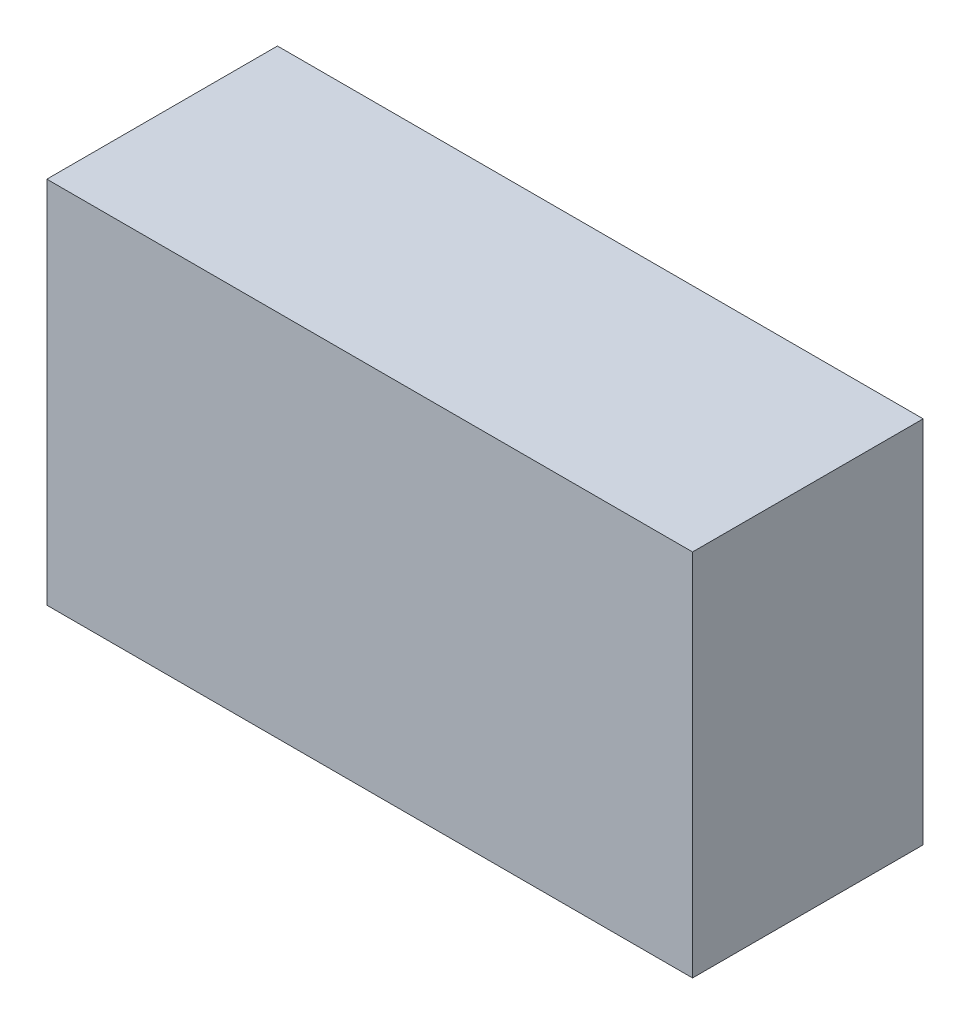
ISO-10303-21;
HEADER;
FILE_DESCRIPTION(('STEP AP214'),'2;1');
FILE_NAME('part.step','',(''),(''),'','','');
FILE_SCHEMA(('AUTOMOTIVE_DESIGN { 1 0 10303 214 1 1 1 1 }'));
ENDSEC;
DATA;
#1=APPLICATION_CONTEXT('core data for automotive mechanical design processes');
#2=APPLICATION_PROTOCOL_DEFINITION('international standard','automotive_design',2000,#1);
#3=PRODUCT_CONTEXT('',#1,'mechanical');
#4=PRODUCT('Part','Part','',(#3));
#5=PRODUCT_RELATED_PRODUCT_CATEGORY('part','',(#4));
#6=PRODUCT_DEFINITION_FORMATION('','',#4);
#7=PRODUCT_DEFINITION_CONTEXT('part definition',#1,'design');
#8=PRODUCT_DEFINITION('design','',#6,#7);
#9=PRODUCT_DEFINITION_SHAPE('','',#8);
#10=(LENGTH_UNIT() NAMED_UNIT(*) SI_UNIT(.MILLI.,.METRE.));
#11=(NAMED_UNIT(*) PLANE_ANGLE_UNIT() SI_UNIT($,.RADIAN.));
#12=(NAMED_UNIT(*) SI_UNIT($,.STERADIAN.) SOLID_ANGLE_UNIT());
#13=UNCERTAINTY_MEASURE_WITH_UNIT(LENGTH_MEASURE(1.E-05),#10,'distance_accuracy_value','');
#14=(GEOMETRIC_REPRESENTATION_CONTEXT(3) GLOBAL_UNCERTAINTY_ASSIGNED_CONTEXT((#13)) GLOBAL_UNIT_ASSIGNED_CONTEXT((#10,
#11,#12)) REPRESENTATION_CONTEXT('',''));
#15=CARTESIAN_POINT('',(0.,0.,0.));
#16=DIRECTION('',(0.,0.,1.));
#17=DIRECTION('',(1.,0.,0.));
#18=AXIS2_PLACEMENT_3D('',#15,#16,#17);
#19=CARTESIAN_POINT('',(280.,1174.,-600.));
#20=DIRECTION('',(-1.,0.,0.));
#21=DIRECTION('',(0.,0.,1.));
#22=AXIS2_PLACEMENT_3D('',#19,#20,#21);
#23=PLANE('',#22);
#24=DIRECTION('',(0.,-1.,0.));
#25=VECTOR('',#24,1.);
#26=CARTESIAN_POINT('',(280.,1174.,-550.));
#27=LINE('',#26,#25);
#28=CARTESIAN_POINT('',(280.,1254.,-550.));
#29=VERTEX_POINT('',#28);
#30=CARTESIAN_POINT('',(280.,1174.,-550.));
#31=VERTEX_POINT('',#30);
#32=EDGE_CURVE('E103',#29,#31,#27,.T.);
#33=ORIENTED_EDGE('',*,*,#32,.F.);
#34=DIRECTION('',(0.,0.,1.));
#35=VECTOR('',#34,1.);
#36=CARTESIAN_POINT('',(280.,1254.,-600.));
#37=LINE('',#36,#35);
#38=CARTESIAN_POINT('',(280.,1254.,-600.));
#39=VERTEX_POINT('',#38);
#40=EDGE_CURVE('E11',#39,#29,#37,.T.);
#41=ORIENTED_EDGE('',*,*,#40,.F.);
#42=DIRECTION('',(0.,-1.,0.));
#43=VECTOR('',#42,1.);
#44=CARTESIAN_POINT('',(280.,1174.,-600.));
#45=LINE('',#44,#43);
#46=CARTESIAN_POINT('',(280.,1174.,-600.));
#47=VERTEX_POINT('',#46);
#48=EDGE_CURVE('E97',#39,#47,#45,.T.);
#49=ORIENTED_EDGE('',*,*,#48,.T.);
#50=DIRECTION('',(0.,0.,1.));
#51=VECTOR('',#50,1.);
#52=CARTESIAN_POINT('',(280.,1174.,-600.));
#53=LINE('',#52,#51);
#54=EDGE_CURVE('E42',#47,#31,#53,.T.);
#55=ORIENTED_EDGE('',*,*,#54,.T.);
#56=EDGE_LOOP('',(#33,#41,#49,#55));
#57=FACE_BOUND('',#56,.T.);
#58=ADVANCED_FACE('F39',(#57),#23,.T.);
#59=CARTESIAN_POINT('',(280.,1254.,-600.));
#60=DIRECTION('',(0.,1.,0.));
#61=DIRECTION('',(0.,0.,1.));
#62=AXIS2_PLACEMENT_3D('',#59,#60,#61);
#63=PLANE('',#62);
#64=DIRECTION('',(-1.,0.,0.));
#65=VECTOR('',#64,1.);
#66=CARTESIAN_POINT('',(280.,1254.,-550.));
#67=LINE('',#66,#65);
#68=CARTESIAN_POINT('',(420.,1254.,-550.));
#69=VERTEX_POINT('',#68);
#70=EDGE_CURVE('E99',#69,#29,#67,.T.);
#71=ORIENTED_EDGE('',*,*,#70,.F.);
#72=DIRECTION('',(0.,0.,1.));
#73=VECTOR('',#72,1.);
#74=CARTESIAN_POINT('',(420.,1254.,-600.));
#75=LINE('',#74,#73);
#76=CARTESIAN_POINT('',(420.,1254.,-600.));
#77=VERTEX_POINT('',#76);
#78=EDGE_CURVE('E48',#77,#69,#75,.T.);
#79=ORIENTED_EDGE('',*,*,#78,.F.);
#80=DIRECTION('',(-1.,0.,0.));
#81=VECTOR('',#80,1.);
#82=CARTESIAN_POINT('',(280.,1254.,-600.));
#83=LINE('',#82,#81);
#84=EDGE_CURVE('E94',#77,#39,#83,.T.);
#85=ORIENTED_EDGE('',*,*,#84,.T.);
#86=ORIENTED_EDGE('',*,*,#40,.T.);
#87=EDGE_LOOP('',(#71,#79,#85,#86));
#88=FACE_BOUND('',#87,.T.);
#89=ADVANCED_FACE('F113',(#88),#63,.T.);
#90=CARTESIAN_POINT('',(420.,1174.,-600.));
#91=DIRECTION('',(1.,0.,0.));
#92=DIRECTION('',(0.,0.,-1.));
#93=AXIS2_PLACEMENT_3D('',#90,#91,#92);
#94=PLANE('',#93);
#95=DIRECTION('',(0.,1.,0.));
#96=VECTOR('',#95,1.);
#97=CARTESIAN_POINT('',(420.,1174.,-550.));
#98=LINE('',#97,#96);
#99=CARTESIAN_POINT('',(420.,1174.,-550.));
#100=VERTEX_POINT('',#99);
#101=EDGE_CURVE('E89',#100,#69,#98,.T.);
#102=ORIENTED_EDGE('',*,*,#101,.F.);
#103=DIRECTION('',(0.,0.,1.));
#104=VECTOR('',#103,1.);
#105=CARTESIAN_POINT('',(420.,1174.,-600.));
#106=LINE('',#105,#104);
#107=CARTESIAN_POINT('',(420.,1174.,-600.));
#108=VERTEX_POINT('',#107);
#109=EDGE_CURVE('E84',#108,#100,#106,.T.);
#110=ORIENTED_EDGE('',*,*,#109,.F.);
#111=DIRECTION('',(0.,1.,0.));
#112=VECTOR('',#111,1.);
#113=CARTESIAN_POINT('',(420.,1174.,-600.));
#114=LINE('',#113,#112);
#115=EDGE_CURVE('E87',#108,#77,#114,.T.);
#116=ORIENTED_EDGE('',*,*,#115,.T.);
#117=ORIENTED_EDGE('',*,*,#78,.T.);
#118=EDGE_LOOP('',(#102,#110,#116,#117));
#119=FACE_BOUND('',#118,.T.);
#120=ADVANCED_FACE('F86',(#119),#94,.T.);
#121=CARTESIAN_POINT('',(280.,1174.,-600.));
#122=DIRECTION('',(0.,-1.,0.));
#123=DIRECTION('',(0.,0.,-1.));
#124=AXIS2_PLACEMENT_3D('',#121,#122,#123);
#125=PLANE('',#124);
#126=DIRECTION('',(1.,0.,0.));
#127=VECTOR('',#126,1.);
#128=CARTESIAN_POINT('',(280.,1174.,-550.));
#129=LINE('',#128,#127);
#130=EDGE_CURVE('E106',#31,#100,#129,.T.);
#131=ORIENTED_EDGE('',*,*,#130,.F.);
#132=ORIENTED_EDGE('',*,*,#54,.F.);
#133=DIRECTION('',(1.,0.,0.));
#134=VECTOR('',#133,1.);
#135=CARTESIAN_POINT('',(280.,1174.,-600.));
#136=LINE('',#135,#134);
#137=EDGE_CURVE('E93',#47,#108,#136,.T.);
#138=ORIENTED_EDGE('',*,*,#137,.T.);
#139=ORIENTED_EDGE('',*,*,#109,.T.);
#140=EDGE_LOOP('',(#131,#132,#138,#139));
#141=FACE_BOUND('',#140,.T.);
#142=ADVANCED_FACE('F96',(#141),#125,.T.);
#143=CARTESIAN_POINT('',(0.,0.,-600.));
#144=DIRECTION('',(0.,0.,-1.));
#145=DIRECTION('',(-1.,0.,0.));
#146=AXIS2_PLACEMENT_3D('',#143,#144,#145);
#147=PLANE('',#146);
#148=ORIENTED_EDGE('',*,*,#48,.F.);
#149=ORIENTED_EDGE('',*,*,#84,.F.);
#150=ORIENTED_EDGE('',*,*,#115,.F.);
#151=ORIENTED_EDGE('',*,*,#137,.F.);
#152=EDGE_LOOP('',(#148,#149,#150,#151));
#153=FACE_BOUND('',#152,.T.);
#154=ADVANCED_FACE('F92',(#153),#147,.T.);
#155=CARTESIAN_POINT('',(0.,0.,-550.));
#156=DIRECTION('',(0.,0.,-1.));
#157=DIRECTION('',(-1.,0.,0.));
#158=AXIS2_PLACEMENT_3D('',#155,#156,#157);
#159=PLANE('',#158);
#160=ORIENTED_EDGE('',*,*,#32,.T.);
#161=ORIENTED_EDGE('',*,*,#130,.T.);
#162=ORIENTED_EDGE('',*,*,#101,.T.);
#163=ORIENTED_EDGE('',*,*,#70,.T.);
#164=EDGE_LOOP('',(#160,#161,#162,#163));
#165=FACE_BOUND('',#164,.T.);
#166=ADVANCED_FACE('F112',(#165),#159,.F.);
#167=CLOSED_SHELL('',(#58,#89,#120,#142,#154,#166));
#168=MANIFOLD_SOLID_BREP('B2',#167);
#169=ADVANCED_BREP_SHAPE_REPRESENTATION('',(#18,#168),#14);
#170=SHAPE_DEFINITION_REPRESENTATION(#9,#169);
ENDSEC;
END-ISO-10303-21;
